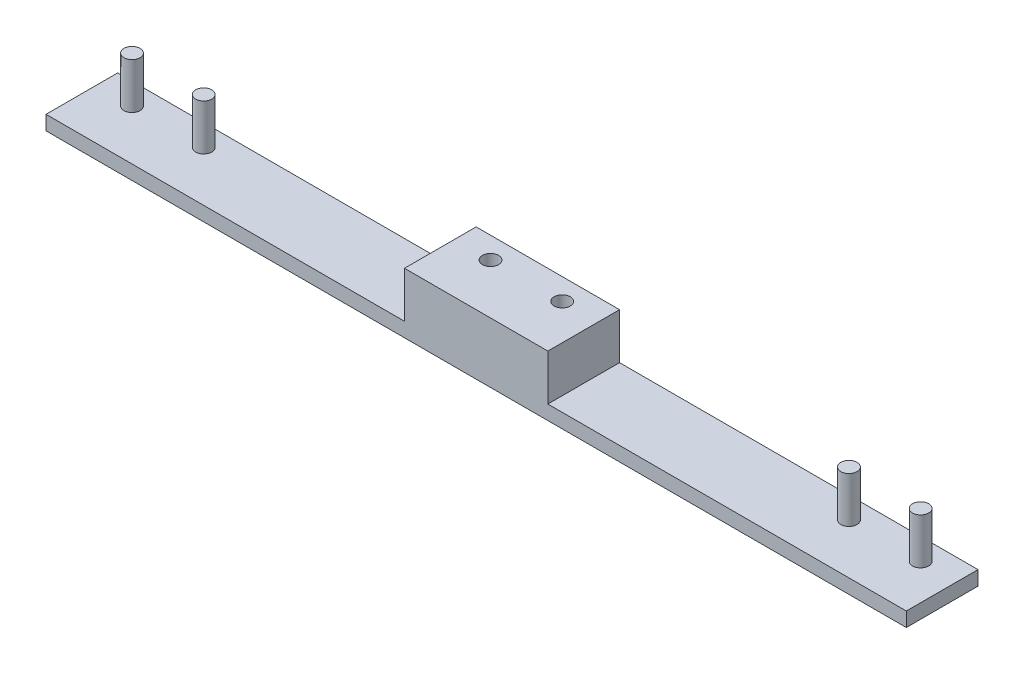
ISO-10303-21;
HEADER;
FILE_DESCRIPTION(('STEP AP214'),'2;1');
FILE_NAME('part.step','',(''),(''),'','','');
FILE_SCHEMA(('AUTOMOTIVE_DESIGN { 1 0 10303 214 1 1 1 1 }'));
ENDSEC;
DATA;
#1=APPLICATION_CONTEXT('core data for automotive mechanical design processes');
#2=APPLICATION_PROTOCOL_DEFINITION('international standard','automotive_design',2000,#1);
#3=PRODUCT_CONTEXT('',#1,'mechanical');
#4=PRODUCT('Part','Part','',(#3));
#5=PRODUCT_RELATED_PRODUCT_CATEGORY('part','',(#4));
#6=PRODUCT_DEFINITION_FORMATION('','',#4);
#7=PRODUCT_DEFINITION_CONTEXT('part definition',#1,'design');
#8=PRODUCT_DEFINITION('design','',#6,#7);
#9=PRODUCT_DEFINITION_SHAPE('','',#8);
#10=(LENGTH_UNIT() NAMED_UNIT(*) SI_UNIT(.MILLI.,.METRE.));
#11=(NAMED_UNIT(*) PLANE_ANGLE_UNIT() SI_UNIT($,.RADIAN.));
#12=(NAMED_UNIT(*) SI_UNIT($,.STERADIAN.) SOLID_ANGLE_UNIT());
#13=UNCERTAINTY_MEASURE_WITH_UNIT(LENGTH_MEASURE(1.E-05),#10,'distance_accuracy_value','');
#14=(GEOMETRIC_REPRESENTATION_CONTEXT(3) GLOBAL_UNCERTAINTY_ASSIGNED_CONTEXT((#13)) GLOBAL_UNIT_ASSIGNED_CONTEXT((#10,
#11,#12)) REPRESENTATION_CONTEXT('',''));
#15=CARTESIAN_POINT('',(0.,0.,0.));
#16=DIRECTION('',(0.,0.,1.));
#17=DIRECTION('',(1.,0.,0.));
#18=AXIS2_PLACEMENT_3D('',#15,#16,#17);
#19=CARTESIAN_POINT('',(0.,-2.,10.));
#20=DIRECTION('',(0.,0.,-1.));
#21=DIRECTION('',(-1.,0.,0.));
#22=AXIS2_PLACEMENT_3D('',#19,#20,#21);
#23=PLANE('',#22);
#24=DIRECTION('',(0.,-1.,0.));
#25=VECTOR('',#24,1.);
#26=CARTESIAN_POINT('',(70.,6.4,10.));
#27=LINE('',#26,#25);
#28=CARTESIAN_POINT('',(70.,6.4,10.));
#29=VERTEX_POINT('',#28);
#30=CARTESIAN_POINT('',(70.,0.,10.));
#31=VERTEX_POINT('',#30);
#32=EDGE_CURVE('E125',#29,#31,#27,.T.);
#33=ORIENTED_EDGE('',*,*,#32,.F.);
#34=DIRECTION('',(1.,0.,0.));
#35=VECTOR('',#34,1.);
#36=CARTESIAN_POINT('',(60.,6.4,10.));
#37=LINE('',#36,#35);
#38=CARTESIAN_POINT('',(50.,6.4,10.));
#39=VERTEX_POINT('',#38);
#40=EDGE_CURVE('E111',#39,#29,#37,.T.);
#41=ORIENTED_EDGE('',*,*,#40,.F.);
#42=DIRECTION('',(0.,-1.,0.));
#43=VECTOR('',#42,1.);
#44=CARTESIAN_POINT('',(50.,6.4,10.));
#45=LINE('',#44,#43);
#46=CARTESIAN_POINT('',(50.,0.,10.));
#47=VERTEX_POINT('',#46);
#48=EDGE_CURVE('E122',#39,#47,#45,.T.);
#49=ORIENTED_EDGE('',*,*,#48,.T.);
#50=DIRECTION('',(-1.,0.,0.));
#51=VECTOR('',#50,1.);
#52=CARTESIAN_POINT('',(0.,0.,10.));
#53=LINE('',#52,#51);
#54=CARTESIAN_POINT('',(0.,0.,10.));
#55=VERTEX_POINT('',#54);
#56=EDGE_CURVE('E222',#47,#55,#53,.T.);
#57=ORIENTED_EDGE('',*,*,#56,.T.);
#58=DIRECTION('',(0.,1.,0.));
#59=VECTOR('',#58,1.);
#60=CARTESIAN_POINT('',(0.,-2.,10.));
#61=LINE('',#60,#59);
#62=CARTESIAN_POINT('',(0.,-2.,10.));
#63=VERTEX_POINT('',#62);
#64=EDGE_CURVE('E218',#63,#55,#61,.T.);
#65=ORIENTED_EDGE('',*,*,#64,.F.);
#66=DIRECTION('',(-1.,0.,0.));
#67=VECTOR('',#66,1.);
#68=CARTESIAN_POINT('',(0.,-2.,10.));
#69=LINE('',#68,#67);
#70=CARTESIAN_POINT('',(120.,-2.,10.));
#71=VERTEX_POINT('',#70);
#72=EDGE_CURVE('E226',#71,#63,#69,.T.);
#73=ORIENTED_EDGE('',*,*,#72,.F.);
#74=DIRECTION('',(0.,1.,0.));
#75=VECTOR('',#74,1.);
#76=CARTESIAN_POINT('',(120.,-2.,10.));
#77=LINE('',#76,#75);
#78=CARTESIAN_POINT('',(120.,0.,10.));
#79=VERTEX_POINT('',#78);
#80=EDGE_CURVE('E157',#71,#79,#77,.T.);
#81=ORIENTED_EDGE('',*,*,#80,.T.);
#82=DIRECTION('',(1.,0.,0.));
#83=VECTOR('',#82,1.);
#84=CARTESIAN_POINT('',(120.,0.,10.));
#85=LINE('',#84,#83);
#86=EDGE_CURVE('E127',#31,#79,#85,.T.);
#87=ORIENTED_EDGE('',*,*,#86,.F.);
#88=EDGE_LOOP('',(#33,#41,#49,#57,#65,#73,#81,#87));
#89=FACE_BOUND('',#88,.T.);
#90=ADVANCED_FACE('F47',(#89),#23,.F.);
#91=CARTESIAN_POINT('',(0.,-2.,0.));
#92=DIRECTION('',(0.,0.,1.));
#93=DIRECTION('',(1.,0.,0.));
#94=AXIS2_PLACEMENT_3D('',#91,#92,#93);
#95=PLANE('',#94);
#96=DIRECTION('',(-1.,0.,0.));
#97=VECTOR('',#96,1.);
#98=CARTESIAN_POINT('',(60.,6.4,0.));
#99=LINE('',#98,#97);
#100=CARTESIAN_POINT('',(70.,6.4,0.));
#101=VERTEX_POINT('',#100);
#102=CARTESIAN_POINT('',(50.,6.4,0.));
#103=VERTEX_POINT('',#102);
#104=EDGE_CURVE('E180',#101,#103,#99,.T.);
#105=ORIENTED_EDGE('',*,*,#104,.F.);
#106=DIRECTION('',(0.,-1.,0.));
#107=VECTOR('',#106,1.);
#108=CARTESIAN_POINT('',(70.,6.4,0.));
#109=LINE('',#108,#107);
#110=CARTESIAN_POINT('',(70.,0.,0.));
#111=VERTEX_POINT('',#110);
#112=EDGE_CURVE('E131',#101,#111,#109,.T.);
#113=ORIENTED_EDGE('',*,*,#112,.T.);
#114=DIRECTION('',(-1.,0.,0.));
#115=VECTOR('',#114,1.);
#116=CARTESIAN_POINT('',(120.,0.,0.));
#117=LINE('',#116,#115);
#118=CARTESIAN_POINT('',(120.,0.,0.));
#119=VERTEX_POINT('',#118);
#120=EDGE_CURVE('E62',#119,#111,#117,.T.);
#121=ORIENTED_EDGE('',*,*,#120,.F.);
#122=DIRECTION('',(0.,1.,0.));
#123=VECTOR('',#122,1.);
#124=CARTESIAN_POINT('',(120.,-2.,0.));
#125=LINE('',#124,#123);
#126=CARTESIAN_POINT('',(120.,-2.,0.));
#127=VERTEX_POINT('',#126);
#128=EDGE_CURVE('E161',#127,#119,#125,.T.);
#129=ORIENTED_EDGE('',*,*,#128,.F.);
#130=DIRECTION('',(1.,0.,0.));
#131=VECTOR('',#130,1.);
#132=CARTESIAN_POINT('',(0.,-2.,0.));
#133=LINE('',#132,#131);
#134=CARTESIAN_POINT('',(0.,-2.,0.));
#135=VERTEX_POINT('',#134);
#136=EDGE_CURVE('E229',#135,#127,#133,.T.);
#137=ORIENTED_EDGE('',*,*,#136,.F.);
#138=DIRECTION('',(0.,1.,0.));
#139=VECTOR('',#138,1.);
#140=CARTESIAN_POINT('',(0.,-2.,0.));
#141=LINE('',#140,#139);
#142=CARTESIAN_POINT('',(0.,0.,0.));
#143=VERTEX_POINT('',#142);
#144=EDGE_CURVE('E214',#135,#143,#141,.T.);
#145=ORIENTED_EDGE('',*,*,#144,.T.);
#146=DIRECTION('',(1.,0.,0.));
#147=VECTOR('',#146,1.);
#148=CARTESIAN_POINT('',(0.,0.,0.));
#149=LINE('',#148,#147);
#150=CARTESIAN_POINT('',(50.,0.,0.));
#151=VERTEX_POINT('',#150);
#152=EDGE_CURVE('E230',#143,#151,#149,.T.);
#153=ORIENTED_EDGE('',*,*,#152,.T.);
#154=DIRECTION('',(0.,-1.,0.));
#155=VECTOR('',#154,1.);
#156=CARTESIAN_POINT('',(50.,6.4,0.));
#157=LINE('',#156,#155);
#158=EDGE_CURVE('E190',#103,#151,#157,.T.);
#159=ORIENTED_EDGE('',*,*,#158,.F.);
#160=EDGE_LOOP('',(#105,#113,#121,#129,#137,#145,#153,#159));
#161=FACE_BOUND('',#160,.T.);
#162=ADVANCED_FACE('F260',(#161),#95,.F.);
#163=CARTESIAN_POINT('',(0.,-2.,0.));
#164=DIRECTION('',(0.,1.,0.));
#165=DIRECTION('',(0.,0.,1.));
#166=AXIS2_PLACEMENT_3D('',#163,#164,#165);
#167=PLANE('',#166);
#168=CARTESIAN_POINT('',(65.,-2.,3.));
#169=DIRECTION('',(0.,-1.,0.));
#170=DIRECTION('',(0.,0.,1.));
#171=AXIS2_PLACEMENT_3D('',#168,#169,#170);
#172=CIRCLE('',#171,1.125);
#173=CARTESIAN_POINT('',(65.,-2.,4.125));
#174=VERTEX_POINT('',#173);
#175=EDGE_CURVE('E493',#174,#174,#172,.T.);
#176=ORIENTED_EDGE('',*,*,#175,.F.);
#177=EDGE_LOOP('',(#176));
#178=FACE_BOUND('',#177,.T.);
#179=CARTESIAN_POINT('',(55.,-2.,3.));
#180=DIRECTION('',(0.,1.,0.));
#181=DIRECTION('',(0.,0.,1.));
#182=AXIS2_PLACEMENT_3D('',#179,#180,#181);
#183=CIRCLE('',#182,1.125);
#184=CARTESIAN_POINT('',(55.,-2.,4.125));
#185=VERTEX_POINT('',#184);
#186=EDGE_CURVE('E171',#185,#185,#183,.T.);
#187=ORIENTED_EDGE('',*,*,#186,.T.);
#188=EDGE_LOOP('',(#187));
#189=FACE_BOUND('',#188,.T.);
#190=ORIENTED_EDGE('',*,*,#72,.T.);
#191=DIRECTION('',(0.,0.,1.));
#192=VECTOR('',#191,1.);
#193=CARTESIAN_POINT('',(0.,-2.,0.));
#194=LINE('',#193,#192);
#195=EDGE_CURVE('E210',#135,#63,#194,.T.);
#196=ORIENTED_EDGE('',*,*,#195,.F.);
#197=ORIENTED_EDGE('',*,*,#136,.T.);
#198=DIRECTION('',(0.,0.,1.));
#199=VECTOR('',#198,1.);
#200=CARTESIAN_POINT('',(120.,-2.,0.));
#201=LINE('',#200,#199);
#202=EDGE_CURVE('E153',#127,#71,#201,.T.);
#203=ORIENTED_EDGE('',*,*,#202,.T.);
#204=EDGE_LOOP('',(#190,#196,#197,#203));
#205=FACE_BOUND('',#204,.T.);
#206=ADVANCED_FACE('F264',(#178,#189,#205),#167,.F.);
#207=CARTESIAN_POINT('',(0.,0.,0.));
#208=DIRECTION('',(0.,1.,0.));
#209=DIRECTION('',(0.,0.,1.));
#210=AXIS2_PLACEMENT_3D('',#207,#208,#209);
#211=PLANE('',#210);
#212=CARTESIAN_POINT('',(15.,0.,3.));
#213=DIRECTION('',(0.,1.,0.));
#214=DIRECTION('',(0.,0.,1.));
#215=AXIS2_PLACEMENT_3D('',#212,#213,#214);
#216=CIRCLE('',#215,1.125);
#217=CARTESIAN_POINT('',(15.,0.,4.125));
#218=VERTEX_POINT('',#217);
#219=EDGE_CURVE('E199',#218,#218,#216,.T.);
#220=ORIENTED_EDGE('',*,*,#219,.F.);
#221=EDGE_LOOP('',(#220));
#222=FACE_BOUND('',#221,.T.);
#223=CARTESIAN_POINT('',(5.,0.,3.));
#224=DIRECTION('',(0.,1.,0.));
#225=DIRECTION('',(0.,0.,1.));
#226=AXIS2_PLACEMENT_3D('',#223,#224,#225);
#227=CIRCLE('',#226,1.125);
#228=CARTESIAN_POINT('',(5.,0.,4.125));
#229=VERTEX_POINT('',#228);
#230=EDGE_CURVE('E193',#229,#229,#227,.T.);
#231=ORIENTED_EDGE('',*,*,#230,.F.);
#232=EDGE_LOOP('',(#231));
#233=FACE_BOUND('',#232,.T.);
#234=ORIENTED_EDGE('',*,*,#56,.F.);
#235=DIRECTION('',(0.,0.,1.));
#236=VECTOR('',#235,1.);
#237=CARTESIAN_POINT('',(50.,0.,0.));
#238=LINE('',#237,#236);
#239=EDGE_CURVE('E179',#151,#47,#238,.T.);
#240=ORIENTED_EDGE('',*,*,#239,.F.);
#241=ORIENTED_EDGE('',*,*,#152,.F.);
#242=DIRECTION('',(0.,0.,1.));
#243=VECTOR('',#242,1.);
#244=CARTESIAN_POINT('',(0.,0.,0.));
#245=LINE('',#244,#243);
#246=EDGE_CURVE('E198',#143,#55,#245,.T.);
#247=ORIENTED_EDGE('',*,*,#246,.T.);
#248=EDGE_LOOP('',(#234,#240,#241,#247));
#249=FACE_BOUND('',#248,.T.);
#250=ADVANCED_FACE('F269',(#222,#233,#249),#211,.T.);
#251=CARTESIAN_POINT('',(0.,-2.,0.));
#252=DIRECTION('',(-1.,0.,0.));
#253=DIRECTION('',(0.,0.,1.));
#254=AXIS2_PLACEMENT_3D('',#251,#252,#253);
#255=PLANE('',#254);
#256=ORIENTED_EDGE('',*,*,#246,.F.);
#257=ORIENTED_EDGE('',*,*,#144,.F.);
#258=ORIENTED_EDGE('',*,*,#195,.T.);
#259=ORIENTED_EDGE('',*,*,#64,.T.);
#260=EDGE_LOOP('',(#256,#257,#258,#259));
#261=FACE_BOUND('',#260,.T.);
#262=ADVANCED_FACE('F274',(#261),#255,.T.);
#263=CARTESIAN_POINT('',(5.,6.4,3.));
#264=DIRECTION('',(0.,-1.,0.));
#265=DIRECTION('',(0.,0.,-1.));
#266=AXIS2_PLACEMENT_3D('',#263,#264,#265);
#267=CYLINDRICAL_SURFACE('',#266,1.125);
#268=CARTESIAN_POINT('',(5.,6.4,3.));
#269=DIRECTION('',(0.,1.,0.));
#270=DIRECTION('',(0.,0.,1.));
#271=AXIS2_PLACEMENT_3D('',#268,#269,#270);
#272=CIRCLE('',#271,1.125);
#273=CARTESIAN_POINT('',(5.,6.4,4.125));
#274=VERTEX_POINT('',#273);
#275=EDGE_CURVE('E203',#274,#274,#272,.T.);
#276=ORIENTED_EDGE('',*,*,#275,.F.);
#277=EDGE_LOOP('',(#276));
#278=FACE_BOUND('',#277,.T.);
#279=ORIENTED_EDGE('',*,*,#230,.T.);
#280=EDGE_LOOP('',(#279));
#281=FACE_BOUND('',#280,.T.);
#282=ADVANCED_FACE('F279',(#278,#281),#267,.T.);
#283=CARTESIAN_POINT('',(0.,6.4,0.));
#284=DIRECTION('',(0.,1.,0.));
#285=DIRECTION('',(0.,0.,1.));
#286=AXIS2_PLACEMENT_3D('',#283,#284,#285);
#287=PLANE('',#286);
#288=ORIENTED_EDGE('',*,*,#275,.T.);
#289=EDGE_LOOP('',(#288));
#290=FACE_BOUND('',#289,.T.);
#291=ADVANCED_FACE('F283',(#290),#287,.T.);
#292=CARTESIAN_POINT('',(15.,6.4,3.));
#293=DIRECTION('',(0.,-1.,0.));
#294=DIRECTION('',(0.,0.,-1.));
#295=AXIS2_PLACEMENT_3D('',#292,#293,#294);
#296=CYLINDRICAL_SURFACE('',#295,1.125);
#297=CARTESIAN_POINT('',(15.,6.4,3.));
#298=DIRECTION('',(0.,1.,0.));
#299=DIRECTION('',(0.,0.,1.));
#300=AXIS2_PLACEMENT_3D('',#297,#298,#299);
#301=CIRCLE('',#300,1.125);
#302=CARTESIAN_POINT('',(15.,6.4,4.125));
#303=VERTEX_POINT('',#302);
#304=EDGE_CURVE('E194',#303,#303,#301,.T.);
#305=ORIENTED_EDGE('',*,*,#304,.F.);
#306=EDGE_LOOP('',(#305));
#307=FACE_BOUND('',#306,.T.);
#308=ORIENTED_EDGE('',*,*,#219,.T.);
#309=EDGE_LOOP('',(#308));
#310=FACE_BOUND('',#309,.T.);
#311=ADVANCED_FACE('F287',(#307,#310),#296,.T.);
#312=CARTESIAN_POINT('',(0.,6.4,0.));
#313=DIRECTION('',(0.,1.,0.));
#314=DIRECTION('',(0.,0.,1.));
#315=AXIS2_PLACEMENT_3D('',#312,#313,#314);
#316=PLANE('',#315);
#317=ORIENTED_EDGE('',*,*,#304,.T.);
#318=EDGE_LOOP('',(#317));
#319=FACE_BOUND('',#318,.T.);
#320=ADVANCED_FACE('F291',(#319),#316,.T.);
#321=CARTESIAN_POINT('',(0.,6.4,0.));
#322=DIRECTION('',(0.,-1.,0.));
#323=DIRECTION('',(0.,0.,-1.));
#324=AXIS2_PLACEMENT_3D('',#321,#322,#323);
#325=PLANE('',#324);
#326=ORIENTED_EDGE('',*,*,#40,.T.);
#327=DIRECTION('',(0.,0.,1.));
#328=VECTOR('',#327,1.);
#329=CARTESIAN_POINT('',(70.,6.4,0.));
#330=LINE('',#329,#328);
#331=EDGE_CURVE('E116',#101,#29,#330,.T.);
#332=ORIENTED_EDGE('',*,*,#331,.F.);
#333=ORIENTED_EDGE('',*,*,#104,.T.);
#334=DIRECTION('',(0.,0.,1.));
#335=VECTOR('',#334,1.);
#336=CARTESIAN_POINT('',(50.,6.4,0.));
#337=LINE('',#336,#335);
#338=EDGE_CURVE('E118',#103,#39,#337,.T.);
#339=ORIENTED_EDGE('',*,*,#338,.T.);
#340=EDGE_LOOP('',(#326,#332,#333,#339));
#341=FACE_BOUND('',#340,.T.);
#342=CARTESIAN_POINT('',(55.,6.4,3.));
#343=DIRECTION('',(0.,1.,0.));
#344=DIRECTION('',(0.,0.,1.));
#345=AXIS2_PLACEMENT_3D('',#342,#343,#344);
#346=CIRCLE('',#345,1.125);
#347=CARTESIAN_POINT('',(55.,6.4,4.125));
#348=VERTEX_POINT('',#347);
#349=EDGE_CURVE('E175',#348,#348,#346,.T.);
#350=ORIENTED_EDGE('',*,*,#349,.F.);
#351=EDGE_LOOP('',(#350));
#352=FACE_BOUND('',#351,.T.);
#353=CARTESIAN_POINT('',(65.,6.4,3.));
#354=DIRECTION('',(0.,-1.,0.));
#355=DIRECTION('',(0.,0.,1.));
#356=AXIS2_PLACEMENT_3D('',#353,#354,#355);
#357=CIRCLE('',#356,1.125);
#358=CARTESIAN_POINT('',(65.,6.4,4.125));
#359=VERTEX_POINT('',#358);
#360=EDGE_CURVE('E140',#359,#359,#357,.T.);
#361=ORIENTED_EDGE('',*,*,#360,.T.);
#362=EDGE_LOOP('',(#361));
#363=FACE_BOUND('',#362,.T.);
#364=ADVANCED_FACE('F113',(#341,#352,#363),#325,.F.);
#365=CARTESIAN_POINT('',(50.,6.4,0.));
#366=DIRECTION('',(1.,0.,0.));
#367=DIRECTION('',(0.,0.,-1.));
#368=AXIS2_PLACEMENT_3D('',#365,#366,#367);
#369=PLANE('',#368);
#370=ORIENTED_EDGE('',*,*,#239,.T.);
#371=ORIENTED_EDGE('',*,*,#48,.F.);
#372=ORIENTED_EDGE('',*,*,#338,.F.);
#373=ORIENTED_EDGE('',*,*,#158,.T.);
#374=EDGE_LOOP('',(#370,#371,#372,#373));
#375=FACE_BOUND('',#374,.T.);
#376=ADVANCED_FACE('F255',(#375),#369,.F.);
#377=CARTESIAN_POINT('',(55.,6.4,3.));
#378=DIRECTION('',(0.,-1.,0.));
#379=DIRECTION('',(0.,0.,-1.));
#380=AXIS2_PLACEMENT_3D('',#377,#378,#379);
#381=CYLINDRICAL_SURFACE('',#380,1.125);
#382=ORIENTED_EDGE('',*,*,#349,.T.);
#383=EDGE_LOOP('',(#382));
#384=FACE_BOUND('',#383,.T.);
#385=ORIENTED_EDGE('',*,*,#186,.F.);
#386=EDGE_LOOP('',(#385));
#387=FACE_BOUND('',#386,.T.);
#388=ADVANCED_FACE('F246',(#384,#387),#381,.F.);
#389=CARTESIAN_POINT('',(120.,0.,0.));
#390=DIRECTION('',(0.,1.,0.));
#391=DIRECTION('',(0.,0.,1.));
#392=AXIS2_PLACEMENT_3D('',#389,#390,#391);
#393=PLANE('',#392);
#394=DIRECTION('',(0.,0.,1.));
#395=VECTOR('',#394,1.);
#396=CARTESIAN_POINT('',(70.,0.,0.));
#397=LINE('',#396,#395);
#398=EDGE_CURVE('E67',#111,#31,#397,.T.);
#399=ORIENTED_EDGE('',*,*,#398,.T.);
#400=ORIENTED_EDGE('',*,*,#86,.T.);
#401=DIRECTION('',(0.,0.,1.));
#402=VECTOR('',#401,1.);
#403=CARTESIAN_POINT('',(120.,0.,0.));
#404=LINE('',#403,#402);
#405=EDGE_CURVE('E149',#119,#79,#404,.T.);
#406=ORIENTED_EDGE('',*,*,#405,.F.);
#407=ORIENTED_EDGE('',*,*,#120,.T.);
#408=EDGE_LOOP('',(#399,#400,#406,#407));
#409=FACE_BOUND('',#408,.T.);
#410=CARTESIAN_POINT('',(105.,0.,3.));
#411=DIRECTION('',(0.,1.,0.));
#412=DIRECTION('',(0.,0.,1.));
#413=AXIS2_PLACEMENT_3D('',#410,#411,#412);
#414=CIRCLE('',#413,1.125);
#415=CARTESIAN_POINT('',(105.,0.,4.125));
#416=VERTEX_POINT('',#415);
#417=EDGE_CURVE('E11',#416,#416,#414,.T.);
#418=ORIENTED_EDGE('',*,*,#417,.F.);
#419=EDGE_LOOP('',(#418));
#420=FACE_BOUND('',#419,.T.);
#421=CARTESIAN_POINT('',(115.,0.,3.));
#422=DIRECTION('',(0.,1.,0.));
#423=DIRECTION('',(0.,0.,1.));
#424=AXIS2_PLACEMENT_3D('',#421,#422,#423);
#425=CIRCLE('',#424,1.125);
#426=CARTESIAN_POINT('',(115.,0.,4.125));
#427=VERTEX_POINT('',#426);
#428=EDGE_CURVE('E55',#427,#427,#425,.T.);
#429=ORIENTED_EDGE('',*,*,#428,.F.);
#430=EDGE_LOOP('',(#429));
#431=FACE_BOUND('',#430,.T.);
#432=ADVANCED_FACE('F243',(#409,#420,#431),#393,.T.);
#433=CARTESIAN_POINT('',(120.,-2.,0.));
#434=DIRECTION('',(-1.,0.,0.));
#435=DIRECTION('',(0.,0.,1.));
#436=AXIS2_PLACEMENT_3D('',#433,#434,#435);
#437=PLANE('',#436);
#438=ORIENTED_EDGE('',*,*,#405,.T.);
#439=ORIENTED_EDGE('',*,*,#80,.F.);
#440=ORIENTED_EDGE('',*,*,#202,.F.);
#441=ORIENTED_EDGE('',*,*,#128,.T.);
#442=EDGE_LOOP('',(#438,#439,#440,#441));
#443=FACE_BOUND('',#442,.T.);
#444=ADVANCED_FACE('F245',(#443),#437,.F.);
#445=CARTESIAN_POINT('',(115.,6.4,3.));
#446=DIRECTION('',(0.,-1.,0.));
#447=DIRECTION('',(0.,0.,-1.));
#448=AXIS2_PLACEMENT_3D('',#445,#446,#447);
#449=CYLINDRICAL_SURFACE('',#448,1.125);
#450=CARTESIAN_POINT('',(115.,6.4,3.));
#451=DIRECTION('',(0.,-1.,0.));
#452=DIRECTION('',(0.,0.,1.));
#453=AXIS2_PLACEMENT_3D('',#450,#451,#452);
#454=CIRCLE('',#453,1.125);
#455=CARTESIAN_POINT('',(115.,6.4,4.125));
#456=VERTEX_POINT('',#455);
#457=EDGE_CURVE('E130',#456,#456,#454,.T.);
#458=ORIENTED_EDGE('',*,*,#457,.T.);
#459=EDGE_LOOP('',(#458));
#460=FACE_BOUND('',#459,.T.);
#461=ORIENTED_EDGE('',*,*,#428,.T.);
#462=EDGE_LOOP('',(#461));
#463=FACE_BOUND('',#462,.T.);
#464=ADVANCED_FACE('F241',(#460,#463),#449,.T.);
#465=CARTESIAN_POINT('',(120.,6.4,0.));
#466=DIRECTION('',(0.,1.,0.));
#467=DIRECTION('',(0.,0.,1.));
#468=AXIS2_PLACEMENT_3D('',#465,#466,#467);
#469=PLANE('',#468);
#470=ORIENTED_EDGE('',*,*,#457,.F.);
#471=EDGE_LOOP('',(#470));
#472=FACE_BOUND('',#471,.T.);
#473=ADVANCED_FACE('F336',(#472),#469,.T.);
#474=CARTESIAN_POINT('',(105.,6.4,3.));
#475=DIRECTION('',(0.,-1.,0.));
#476=DIRECTION('',(0.,0.,-1.));
#477=AXIS2_PLACEMENT_3D('',#474,#475,#476);
#478=CYLINDRICAL_SURFACE('',#477,1.125);
#479=CARTESIAN_POINT('',(105.,6.4,3.));
#480=DIRECTION('',(0.,-1.,0.));
#481=DIRECTION('',(0.,0.,1.));
#482=AXIS2_PLACEMENT_3D('',#479,#480,#481);
#483=CIRCLE('',#482,1.125);
#484=CARTESIAN_POINT('',(105.,6.4,4.125));
#485=VERTEX_POINT('',#484);
#486=EDGE_CURVE('E145',#485,#485,#483,.T.);
#487=ORIENTED_EDGE('',*,*,#486,.T.);
#488=EDGE_LOOP('',(#487));
#489=FACE_BOUND('',#488,.T.);
#490=ORIENTED_EDGE('',*,*,#417,.T.);
#491=EDGE_LOOP('',(#490));
#492=FACE_BOUND('',#491,.T.);
#493=ADVANCED_FACE('F346',(#489,#492),#478,.T.);
#494=CARTESIAN_POINT('',(120.,6.4,0.));
#495=DIRECTION('',(0.,1.,0.));
#496=DIRECTION('',(0.,0.,1.));
#497=AXIS2_PLACEMENT_3D('',#494,#495,#496);
#498=PLANE('',#497);
#499=ORIENTED_EDGE('',*,*,#486,.F.);
#500=EDGE_LOOP('',(#499));
#501=FACE_BOUND('',#500,.T.);
#502=ADVANCED_FACE('F356',(#501),#498,.T.);
#503=CARTESIAN_POINT('',(70.,6.4,0.));
#504=DIRECTION('',(1.,0.,0.));
#505=DIRECTION('',(0.,0.,-1.));
#506=AXIS2_PLACEMENT_3D('',#503,#504,#505);
#507=PLANE('',#506);
#508=ORIENTED_EDGE('',*,*,#398,.F.);
#509=ORIENTED_EDGE('',*,*,#112,.F.);
#510=ORIENTED_EDGE('',*,*,#331,.T.);
#511=ORIENTED_EDGE('',*,*,#32,.T.);
#512=EDGE_LOOP('',(#508,#509,#510,#511));
#513=FACE_BOUND('',#512,.T.);
#514=ADVANCED_FACE('F134',(#513),#507,.T.);
#515=CARTESIAN_POINT('',(65.,6.4,3.));
#516=DIRECTION('',(0.,-1.,0.));
#517=DIRECTION('',(0.,0.,-1.));
#518=AXIS2_PLACEMENT_3D('',#515,#516,#517);
#519=CYLINDRICAL_SURFACE('',#518,1.125);
#520=ORIENTED_EDGE('',*,*,#360,.F.);
#521=EDGE_LOOP('',(#520));
#522=FACE_BOUND('',#521,.T.);
#523=ORIENTED_EDGE('',*,*,#175,.T.);
#524=EDGE_LOOP('',(#523));
#525=FACE_BOUND('',#524,.T.);
#526=ADVANCED_FACE('F472',(#522,#525),#519,.F.);
#527=CLOSED_SHELL('',(#90,#162,#206,#250,#262,#282,#291,#311,#320,#364,#376,#388,#432,#444,#464,
#473,#493,#502,#514,#526));
#528=MANIFOLD_SOLID_BREP('B2',#527);
#529=ADVANCED_BREP_SHAPE_REPRESENTATION('',(#18,#528),#14);
#530=SHAPE_DEFINITION_REPRESENTATION(#9,#529);
ENDSEC;
END-ISO-10303-21;
